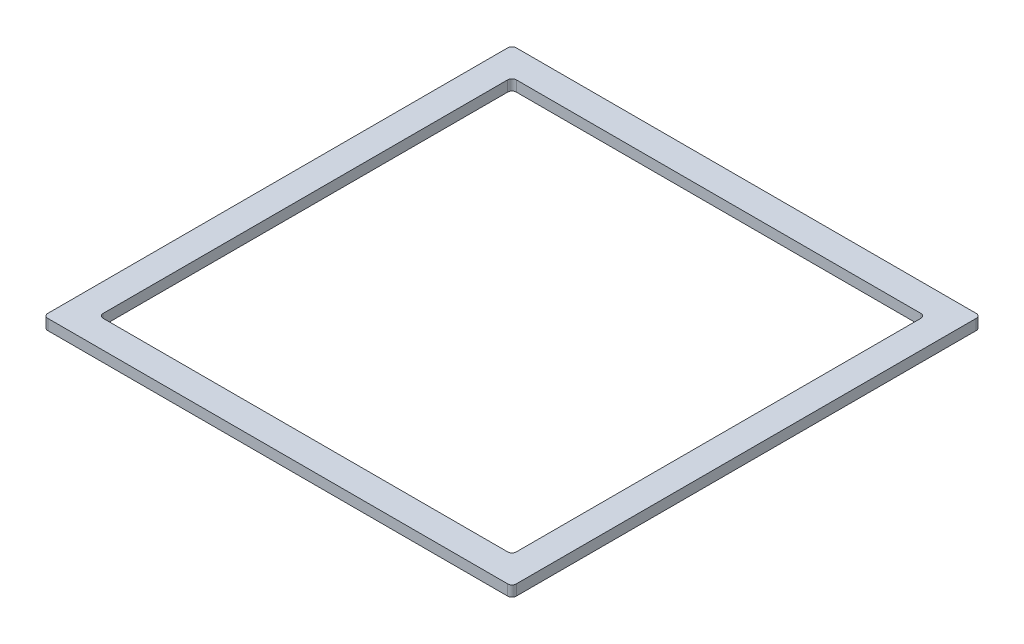
ISO-10303-21;
HEADER;
FILE_DESCRIPTION(('STEP AP214'),'2;1');
FILE_NAME('part.step','',(''),(''),'','','');
FILE_SCHEMA(('AUTOMOTIVE_DESIGN { 1 0 10303 214 1 1 1 1 }'));
ENDSEC;
DATA;
#1=APPLICATION_CONTEXT('core data for automotive mechanical design processes');
#2=APPLICATION_PROTOCOL_DEFINITION('international standard','automotive_design',2000,#1);
#3=PRODUCT_CONTEXT('',#1,'mechanical');
#4=PRODUCT('Part','Part','',(#3));
#5=PRODUCT_RELATED_PRODUCT_CATEGORY('part','',(#4));
#6=PRODUCT_DEFINITION_FORMATION('','',#4);
#7=PRODUCT_DEFINITION_CONTEXT('part definition',#1,'design');
#8=PRODUCT_DEFINITION('design','',#6,#7);
#9=PRODUCT_DEFINITION_SHAPE('','',#8);
#10=(LENGTH_UNIT() NAMED_UNIT(*) SI_UNIT(.MILLI.,.METRE.));
#11=(NAMED_UNIT(*) PLANE_ANGLE_UNIT() SI_UNIT($,.RADIAN.));
#12=(NAMED_UNIT(*) SI_UNIT($,.STERADIAN.) SOLID_ANGLE_UNIT());
#13=UNCERTAINTY_MEASURE_WITH_UNIT(LENGTH_MEASURE(1.E-05),#10,'distance_accuracy_value','');
#14=(GEOMETRIC_REPRESENTATION_CONTEXT(3) GLOBAL_UNCERTAINTY_ASSIGNED_CONTEXT((#13)) GLOBAL_UNIT_ASSIGNED_CONTEXT((#10,
#11,#12)) REPRESENTATION_CONTEXT('',''));
#15=CARTESIAN_POINT('',(0.,0.,0.));
#16=DIRECTION('',(0.,0.,1.));
#17=DIRECTION('',(1.,0.,0.));
#18=AXIS2_PLACEMENT_3D('',#15,#16,#17);
#19=CARTESIAN_POINT('',(0.,5.,0.));
#20=DIRECTION('',(0.,1.,0.));
#21=DIRECTION('',(0.,0.,1.));
#22=AXIS2_PLACEMENT_3D('',#19,#20,#21);
#23=PLANE('',#22);
#24=DIRECTION('',(0.,0.,1.));
#25=VECTOR('',#24,1.);
#26=CARTESIAN_POINT('',(-110.,5.,-110.));
#27=LINE('',#26,#25);
#28=CARTESIAN_POINT('',(-110.,5.,-108.));
#29=VERTEX_POINT('',#28);
#30=CARTESIAN_POINT('',(-110.,5.,108.));
#31=VERTEX_POINT('',#30);
#32=EDGE_CURVE('E178',#29,#31,#27,.T.);
#33=ORIENTED_EDGE('',*,*,#32,.T.);
#34=CARTESIAN_POINT('',(-108.,5.,108.));
#35=DIRECTION('',(0.,1.,0.));
#36=DIRECTION('',(0.,0.,1.));
#37=AXIS2_PLACEMENT_3D('',#34,#35,#36);
#38=CIRCLE('',#37,2.);
#39=CARTESIAN_POINT('',(-108.,5.,110.));
#40=VERTEX_POINT('',#39);
#41=EDGE_CURVE('E220',#31,#40,#38,.T.);
#42=ORIENTED_EDGE('',*,*,#41,.T.);
#43=DIRECTION('',(1.,0.,0.));
#44=VECTOR('',#43,1.);
#45=CARTESIAN_POINT('',(-110.,5.,110.));
#46=LINE('',#45,#44);
#47=CARTESIAN_POINT('',(108.,5.,110.));
#48=VERTEX_POINT('',#47);
#49=EDGE_CURVE('E173',#40,#48,#46,.T.);
#50=ORIENTED_EDGE('',*,*,#49,.T.);
#51=CARTESIAN_POINT('',(108.,5.,108.));
#52=DIRECTION('',(0.,1.,0.));
#53=DIRECTION('',(0.,0.,1.));
#54=AXIS2_PLACEMENT_3D('',#51,#52,#53);
#55=CIRCLE('',#54,2.);
#56=CARTESIAN_POINT('',(110.,5.,108.));
#57=VERTEX_POINT('',#56);
#58=EDGE_CURVE('E215',#48,#57,#55,.T.);
#59=ORIENTED_EDGE('',*,*,#58,.T.);
#60=DIRECTION('',(0.,0.,-1.));
#61=VECTOR('',#60,1.);
#62=CARTESIAN_POINT('',(110.,5.,-110.));
#63=LINE('',#62,#61);
#64=CARTESIAN_POINT('',(110.,5.,-108.));
#65=VERTEX_POINT('',#64);
#66=EDGE_CURVE('E270',#57,#65,#63,.T.);
#67=ORIENTED_EDGE('',*,*,#66,.T.);
#68=CARTESIAN_POINT('',(108.,5.,-108.));
#69=DIRECTION('',(0.,1.,0.));
#70=DIRECTION('',(0.,0.,1.));
#71=AXIS2_PLACEMENT_3D('',#68,#69,#70);
#72=CIRCLE('',#71,2.);
#73=CARTESIAN_POINT('',(108.,5.,-110.));
#74=VERTEX_POINT('',#73);
#75=EDGE_CURVE('E58',#65,#74,#72,.T.);
#76=ORIENTED_EDGE('',*,*,#75,.T.);
#77=DIRECTION('',(-1.,0.,0.));
#78=VECTOR('',#77,1.);
#79=CARTESIAN_POINT('',(-110.,5.,-110.));
#80=LINE('',#79,#78);
#81=CARTESIAN_POINT('',(-108.,5.,-110.));
#82=VERTEX_POINT('',#81);
#83=EDGE_CURVE('E272',#74,#82,#80,.T.);
#84=ORIENTED_EDGE('',*,*,#83,.T.);
#85=CARTESIAN_POINT('',(-108.,5.,-108.));
#86=DIRECTION('',(0.,1.,0.));
#87=DIRECTION('',(0.,0.,1.));
#88=AXIS2_PLACEMENT_3D('',#85,#86,#87);
#89=CIRCLE('',#88,2.);
#90=EDGE_CURVE('E218',#82,#29,#89,.T.);
#91=ORIENTED_EDGE('',*,*,#90,.T.);
#92=EDGE_LOOP('',(#33,#42,#50,#59,#67,#76,#84,#91));
#93=FACE_BOUND('',#92,.T.);
#94=DIRECTION('',(-1.,0.,0.));
#95=VECTOR('',#94,1.);
#96=CARTESIAN_POINT('',(-97.,5.,-97.));
#97=LINE('',#96,#95);
#98=CARTESIAN_POINT('',(94.9999999999999,5.,-97.));
#99=VERTEX_POINT('',#98);
#100=CARTESIAN_POINT('',(-95.,5.,-97.));
#101=VERTEX_POINT('',#100);
#102=EDGE_CURVE('E468',#99,#101,#97,.T.);
#103=ORIENTED_EDGE('',*,*,#102,.F.);
#104=CARTESIAN_POINT('',(95.,5.,-95.));
#105=DIRECTION('',(0.,1.,0.));
#106=DIRECTION('',(0.,0.,1.));
#107=AXIS2_PLACEMENT_3D('',#104,#105,#106);
#108=CIRCLE('',#107,2.);
#109=CARTESIAN_POINT('',(97.,5.,-95.));
#110=VERTEX_POINT('',#109);
#111=EDGE_CURVE('E11',#99,#110,#108,.F.);
#112=ORIENTED_EDGE('',*,*,#111,.T.);
#113=DIRECTION('',(0.,0.,-1.));
#114=VECTOR('',#113,1.);
#115=CARTESIAN_POINT('',(97.,5.,-97.));
#116=LINE('',#115,#114);
#117=CARTESIAN_POINT('',(97.,5.,95.));
#118=VERTEX_POINT('',#117);
#119=EDGE_CURVE('E249',#118,#110,#116,.T.);
#120=ORIENTED_EDGE('',*,*,#119,.F.);
#121=CARTESIAN_POINT('',(95.,5.,95.));
#122=DIRECTION('',(0.,1.,0.));
#123=DIRECTION('',(0.,0.,1.));
#124=AXIS2_PLACEMENT_3D('',#121,#122,#123);
#125=CIRCLE('',#124,2.);
#126=CARTESIAN_POINT('',(95.,5.,97.));
#127=VERTEX_POINT('',#126);
#128=EDGE_CURVE('E160',#118,#127,#125,.F.);
#129=ORIENTED_EDGE('',*,*,#128,.T.);
#130=DIRECTION('',(1.,0.,0.));
#131=VECTOR('',#130,1.);
#132=CARTESIAN_POINT('',(-97.,5.,97.));
#133=LINE('',#132,#131);
#134=CARTESIAN_POINT('',(-95.,5.,97.));
#135=VERTEX_POINT('',#134);
#136=EDGE_CURVE('E246',#135,#127,#133,.T.);
#137=ORIENTED_EDGE('',*,*,#136,.F.);
#138=CARTESIAN_POINT('',(-95.,5.,95.));
#139=DIRECTION('',(0.,1.,0.));
#140=DIRECTION('',(0.,0.,1.));
#141=AXIS2_PLACEMENT_3D('',#138,#139,#140);
#142=CIRCLE('',#141,2.);
#143=CARTESIAN_POINT('',(-97.,5.,95.));
#144=VERTEX_POINT('',#143);
#145=EDGE_CURVE('E237',#135,#144,#142,.F.);
#146=ORIENTED_EDGE('',*,*,#145,.T.);
#147=DIRECTION('',(0.,0.,1.));
#148=VECTOR('',#147,1.);
#149=CARTESIAN_POINT('',(-97.,5.,-97.));
#150=LINE('',#149,#148);
#151=CARTESIAN_POINT('',(-97.,5.,-95.));
#152=VERTEX_POINT('',#151);
#153=EDGE_CURVE('E258',#152,#144,#150,.T.);
#154=ORIENTED_EDGE('',*,*,#153,.F.);
#155=CARTESIAN_POINT('',(-95.,5.,-95.));
#156=DIRECTION('',(0.,1.,0.));
#157=DIRECTION('',(0.,0.,1.));
#158=AXIS2_PLACEMENT_3D('',#155,#156,#157);
#159=CIRCLE('',#158,2.);
#160=EDGE_CURVE('E233',#152,#101,#159,.F.);
#161=ORIENTED_EDGE('',*,*,#160,.T.);
#162=EDGE_LOOP('',(#103,#112,#120,#129,#137,#146,#154,#161));
#163=FACE_BOUND('',#162,.T.);
#164=ADVANCED_FACE('F36',(#93,#163),#23,.T.);
#165=CARTESIAN_POINT('',(0.,0.,0.));
#166=DIRECTION('',(0.,1.,0.));
#167=DIRECTION('',(0.,0.,1.));
#168=AXIS2_PLACEMENT_3D('',#165,#166,#167);
#169=PLANE('',#168);
#170=DIRECTION('',(1.,0.,0.));
#171=VECTOR('',#170,1.);
#172=CARTESIAN_POINT('',(-110.,0.,110.));
#173=LINE('',#172,#171);
#174=CARTESIAN_POINT('',(-108.,0.,110.));
#175=VERTEX_POINT('',#174);
#176=CARTESIAN_POINT('',(108.,0.,110.));
#177=VERTEX_POINT('',#176);
#178=EDGE_CURVE('E181',#175,#177,#173,.T.);
#179=ORIENTED_EDGE('',*,*,#178,.F.);
#180=CARTESIAN_POINT('',(-108.,0.,108.));
#181=DIRECTION('',(0.,1.,0.));
#182=DIRECTION('',(0.,0.,1.));
#183=AXIS2_PLACEMENT_3D('',#180,#181,#182);
#184=CIRCLE('',#183,2.);
#185=CARTESIAN_POINT('',(-110.,0.,108.));
#186=VERTEX_POINT('',#185);
#187=EDGE_CURVE('E208',#175,#186,#184,.F.);
#188=ORIENTED_EDGE('',*,*,#187,.T.);
#189=DIRECTION('',(0.,0.,1.));
#190=VECTOR('',#189,1.);
#191=CARTESIAN_POINT('',(-110.,0.,-110.));
#192=LINE('',#191,#190);
#193=CARTESIAN_POINT('',(-110.,0.,-108.));
#194=VERTEX_POINT('',#193);
#195=EDGE_CURVE('E279',#194,#186,#192,.T.);
#196=ORIENTED_EDGE('',*,*,#195,.F.);
#197=CARTESIAN_POINT('',(-108.,0.,-108.));
#198=DIRECTION('',(0.,1.,0.));
#199=DIRECTION('',(0.,0.,1.));
#200=AXIS2_PLACEMENT_3D('',#197,#198,#199);
#201=CIRCLE('',#200,2.);
#202=CARTESIAN_POINT('',(-108.,0.,-110.));
#203=VERTEX_POINT('',#202);
#204=EDGE_CURVE('E206',#194,#203,#201,.F.);
#205=ORIENTED_EDGE('',*,*,#204,.T.);
#206=DIRECTION('',(-1.,0.,0.));
#207=VECTOR('',#206,1.);
#208=CARTESIAN_POINT('',(-110.,0.,-110.));
#209=LINE('',#208,#207);
#210=CARTESIAN_POINT('',(108.,0.,-110.));
#211=VERTEX_POINT('',#210);
#212=EDGE_CURVE('E278',#211,#203,#209,.T.);
#213=ORIENTED_EDGE('',*,*,#212,.F.);
#214=CARTESIAN_POINT('',(108.,0.,-108.));
#215=DIRECTION('',(0.,1.,0.));
#216=DIRECTION('',(0.,0.,1.));
#217=AXIS2_PLACEMENT_3D('',#214,#215,#216);
#218=CIRCLE('',#217,2.);
#219=CARTESIAN_POINT('',(110.,0.,-108.));
#220=VERTEX_POINT('',#219);
#221=EDGE_CURVE('E204',#211,#220,#218,.F.);
#222=ORIENTED_EDGE('',*,*,#221,.T.);
#223=DIRECTION('',(0.,0.,-1.));
#224=VECTOR('',#223,1.);
#225=CARTESIAN_POINT('',(110.,0.,-110.));
#226=LINE('',#225,#224);
#227=CARTESIAN_POINT('',(110.,0.,108.));
#228=VERTEX_POINT('',#227);
#229=EDGE_CURVE('E257',#228,#220,#226,.T.);
#230=ORIENTED_EDGE('',*,*,#229,.F.);
#231=CARTESIAN_POINT('',(108.,0.,108.));
#232=DIRECTION('',(0.,1.,0.));
#233=DIRECTION('',(0.,0.,1.));
#234=AXIS2_PLACEMENT_3D('',#231,#232,#233);
#235=CIRCLE('',#234,2.);
#236=EDGE_CURVE('E202',#228,#177,#235,.F.);
#237=ORIENTED_EDGE('',*,*,#236,.T.);
#238=EDGE_LOOP('',(#179,#188,#196,#205,#213,#222,#230,#237));
#239=FACE_BOUND('',#238,.T.);
#240=DIRECTION('',(1.,0.,0.));
#241=VECTOR('',#240,1.);
#242=CARTESIAN_POINT('',(-97.,0.,97.));
#243=LINE('',#242,#241);
#244=CARTESIAN_POINT('',(-95.,0.,97.));
#245=VERTEX_POINT('',#244);
#246=CARTESIAN_POINT('',(95.,0.,97.));
#247=VERTEX_POINT('',#246);
#248=EDGE_CURVE('E261',#245,#247,#243,.T.);
#249=ORIENTED_EDGE('',*,*,#248,.T.);
#250=CARTESIAN_POINT('',(95.,0.,95.));
#251=DIRECTION('',(0.,1.,0.));
#252=DIRECTION('',(0.,0.,1.));
#253=AXIS2_PLACEMENT_3D('',#250,#251,#252);
#254=CIRCLE('',#253,2.);
#255=CARTESIAN_POINT('',(97.,0.,95.));
#256=VERTEX_POINT('',#255);
#257=EDGE_CURVE('E239',#247,#256,#254,.T.);
#258=ORIENTED_EDGE('',*,*,#257,.T.);
#259=DIRECTION('',(0.,0.,-1.));
#260=VECTOR('',#259,1.);
#261=CARTESIAN_POINT('',(97.,0.,-97.));
#262=LINE('',#261,#260);
#263=CARTESIAN_POINT('',(97.,0.,-95.));
#264=VERTEX_POINT('',#263);
#265=EDGE_CURVE('E155',#256,#264,#262,.T.);
#266=ORIENTED_EDGE('',*,*,#265,.T.);
#267=CARTESIAN_POINT('',(95.,0.,-95.));
#268=DIRECTION('',(0.,1.,0.));
#269=DIRECTION('',(0.,0.,1.));
#270=AXIS2_PLACEMENT_3D('',#267,#268,#269);
#271=CIRCLE('',#270,2.);
#272=CARTESIAN_POINT('',(94.9999999999999,0.,-97.));
#273=VERTEX_POINT('',#272);
#274=EDGE_CURVE('E44',#264,#273,#271,.T.);
#275=ORIENTED_EDGE('',*,*,#274,.T.);
#276=DIRECTION('',(-1.,0.,0.));
#277=VECTOR('',#276,1.);
#278=CARTESIAN_POINT('',(-97.,0.,-97.));
#279=LINE('',#278,#277);
#280=CARTESIAN_POINT('',(-95.,0.,-97.));
#281=VERTEX_POINT('',#280);
#282=EDGE_CURVE('E153',#273,#281,#279,.T.);
#283=ORIENTED_EDGE('',*,*,#282,.T.);
#284=CARTESIAN_POINT('',(-95.,0.,-95.));
#285=DIRECTION('',(0.,1.,0.));
#286=DIRECTION('',(0.,0.,1.));
#287=AXIS2_PLACEMENT_3D('',#284,#285,#286);
#288=CIRCLE('',#287,2.);
#289=CARTESIAN_POINT('',(-97.,0.,-95.));
#290=VERTEX_POINT('',#289);
#291=EDGE_CURVE('E231',#281,#290,#288,.T.);
#292=ORIENTED_EDGE('',*,*,#291,.T.);
#293=DIRECTION('',(0.,0.,1.));
#294=VECTOR('',#293,1.);
#295=CARTESIAN_POINT('',(-97.,0.,-97.));
#296=LINE('',#295,#294);
#297=CARTESIAN_POINT('',(-97.,0.,95.));
#298=VERTEX_POINT('',#297);
#299=EDGE_CURVE('E169',#290,#298,#296,.T.);
#300=ORIENTED_EDGE('',*,*,#299,.T.);
#301=CARTESIAN_POINT('',(-95.,0.,95.));
#302=DIRECTION('',(0.,1.,0.));
#303=DIRECTION('',(0.,0.,1.));
#304=AXIS2_PLACEMENT_3D('',#301,#302,#303);
#305=CIRCLE('',#304,2.);
#306=EDGE_CURVE('E235',#298,#245,#305,.T.);
#307=ORIENTED_EDGE('',*,*,#306,.T.);
#308=EDGE_LOOP('',(#249,#258,#266,#275,#283,#292,#300,#307));
#309=FACE_BOUND('',#308,.T.);
#310=ADVANCED_FACE('F152',(#239,#309),#169,.F.);
#311=CARTESIAN_POINT('',(110.,5.,-110.));
#312=DIRECTION('',(-1.,0.,0.));
#313=DIRECTION('',(0.,0.,1.));
#314=AXIS2_PLACEMENT_3D('',#311,#312,#313);
#315=PLANE('',#314);
#316=ORIENTED_EDGE('',*,*,#229,.T.);
#317=DIRECTION('',(0.,-1.,0.));
#318=VECTOR('',#317,1.);
#319=CARTESIAN_POINT('',(110.,5.,-108.));
#320=LINE('',#319,#318);
#321=EDGE_CURVE('E229',#220,#65,#320,.F.);
#322=ORIENTED_EDGE('',*,*,#321,.T.);
#323=ORIENTED_EDGE('',*,*,#66,.F.);
#324=DIRECTION('',(0.,-1.,0.));
#325=VECTOR('',#324,1.);
#326=CARTESIAN_POINT('',(110.,5.,108.));
#327=LINE('',#326,#325);
#328=EDGE_CURVE('E226',#57,#228,#327,.T.);
#329=ORIENTED_EDGE('',*,*,#328,.T.);
#330=EDGE_LOOP('',(#316,#322,#323,#329));
#331=FACE_BOUND('',#330,.T.);
#332=ADVANCED_FACE('F297',(#331),#315,.F.);
#333=CARTESIAN_POINT('',(-110.,5.,-110.));
#334=DIRECTION('',(0.,0.,1.));
#335=DIRECTION('',(1.,0.,0.));
#336=AXIS2_PLACEMENT_3D('',#333,#334,#335);
#337=PLANE('',#336);
#338=ORIENTED_EDGE('',*,*,#212,.T.);
#339=DIRECTION('',(0.,-1.,0.));
#340=VECTOR('',#339,1.);
#341=CARTESIAN_POINT('',(-108.,5.,-110.));
#342=LINE('',#341,#340);
#343=EDGE_CURVE('E51',#203,#82,#342,.F.);
#344=ORIENTED_EDGE('',*,*,#343,.T.);
#345=ORIENTED_EDGE('',*,*,#83,.F.);
#346=DIRECTION('',(0.,-1.,0.));
#347=VECTOR('',#346,1.);
#348=CARTESIAN_POINT('',(108.,5.,-110.));
#349=LINE('',#348,#347);
#350=EDGE_CURVE('E222',#74,#211,#349,.T.);
#351=ORIENTED_EDGE('',*,*,#350,.T.);
#352=EDGE_LOOP('',(#338,#344,#345,#351));
#353=FACE_BOUND('',#352,.T.);
#354=ADVANCED_FACE('F304',(#353),#337,.F.);
#355=CARTESIAN_POINT('',(-110.,5.,-110.));
#356=DIRECTION('',(1.,0.,0.));
#357=DIRECTION('',(0.,0.,-1.));
#358=AXIS2_PLACEMENT_3D('',#355,#356,#357);
#359=PLANE('',#358);
#360=ORIENTED_EDGE('',*,*,#195,.T.);
#361=DIRECTION('',(0.,-1.,0.));
#362=VECTOR('',#361,1.);
#363=CARTESIAN_POINT('',(-110.,5.,108.));
#364=LINE('',#363,#362);
#365=EDGE_CURVE('E213',#186,#31,#364,.F.);
#366=ORIENTED_EDGE('',*,*,#365,.T.);
#367=ORIENTED_EDGE('',*,*,#32,.F.);
#368=DIRECTION('',(0.,-1.,0.));
#369=VECTOR('',#368,1.);
#370=CARTESIAN_POINT('',(-110.,5.,-108.));
#371=LINE('',#370,#369);
#372=EDGE_CURVE('E210',#29,#194,#371,.T.);
#373=ORIENTED_EDGE('',*,*,#372,.T.);
#374=EDGE_LOOP('',(#360,#366,#367,#373));
#375=FACE_BOUND('',#374,.T.);
#376=ADVANCED_FACE('F310',(#375),#359,.F.);
#377=CARTESIAN_POINT('',(-110.,5.,110.));
#378=DIRECTION('',(0.,0.,-1.));
#379=DIRECTION('',(-1.,0.,0.));
#380=AXIS2_PLACEMENT_3D('',#377,#378,#379);
#381=PLANE('',#380);
#382=ORIENTED_EDGE('',*,*,#49,.F.);
#383=DIRECTION('',(0.,-1.,0.));
#384=VECTOR('',#383,1.);
#385=CARTESIAN_POINT('',(-108.,5.,110.));
#386=LINE('',#385,#384);
#387=EDGE_CURVE('E199',#40,#175,#386,.T.);
#388=ORIENTED_EDGE('',*,*,#387,.T.);
#389=ORIENTED_EDGE('',*,*,#178,.T.);
#390=DIRECTION('',(0.,-1.,0.));
#391=VECTOR('',#390,1.);
#392=CARTESIAN_POINT('',(108.,5.,110.));
#393=LINE('',#392,#391);
#394=EDGE_CURVE('E197',#177,#48,#393,.F.);
#395=ORIENTED_EDGE('',*,*,#394,.T.);
#396=EDGE_LOOP('',(#382,#388,#389,#395));
#397=FACE_BOUND('',#396,.T.);
#398=ADVANCED_FACE('F289',(#397),#381,.F.);
#399=CARTESIAN_POINT('',(97.,5.,-97.));
#400=DIRECTION('',(-1.,0.,0.));
#401=DIRECTION('',(0.,0.,1.));
#402=AXIS2_PLACEMENT_3D('',#399,#400,#401);
#403=PLANE('',#402);
#404=ORIENTED_EDGE('',*,*,#265,.F.);
#405=DIRECTION('',(0.,-1.,0.));
#406=VECTOR('',#405,1.);
#407=CARTESIAN_POINT('',(97.,5.,95.));
#408=LINE('',#407,#406);
#409=EDGE_CURVE('E195',#256,#118,#408,.F.);
#410=ORIENTED_EDGE('',*,*,#409,.T.);
#411=ORIENTED_EDGE('',*,*,#119,.T.);
#412=DIRECTION('',(0.,-1.,0.));
#413=VECTOR('',#412,1.);
#414=CARTESIAN_POINT('',(97.,0.,-95.));
#415=LINE('',#414,#413);
#416=EDGE_CURVE('E193',#110,#264,#415,.T.);
#417=ORIENTED_EDGE('',*,*,#416,.T.);
#418=EDGE_LOOP('',(#404,#410,#411,#417));
#419=FACE_BOUND('',#418,.T.);
#420=ADVANCED_FACE('F263',(#419),#403,.T.);
#421=CARTESIAN_POINT('',(-97.,5.,-97.));
#422=DIRECTION('',(0.,0.,1.));
#423=DIRECTION('',(1.,0.,0.));
#424=AXIS2_PLACEMENT_3D('',#421,#422,#423);
#425=PLANE('',#424);
#426=ORIENTED_EDGE('',*,*,#102,.T.);
#427=DIRECTION('',(0.,-1.,0.));
#428=VECTOR('',#427,1.);
#429=CARTESIAN_POINT('',(-95.,0.,-97.));
#430=LINE('',#429,#428);
#431=EDGE_CURVE('E168',#101,#281,#430,.T.);
#432=ORIENTED_EDGE('',*,*,#431,.T.);
#433=ORIENTED_EDGE('',*,*,#282,.F.);
#434=DIRECTION('',(0.,-1.,0.));
#435=VECTOR('',#434,1.);
#436=CARTESIAN_POINT('',(95.,5.,-97.));
#437=LINE('',#436,#435);
#438=EDGE_CURVE('E165',#273,#99,#437,.F.);
#439=ORIENTED_EDGE('',*,*,#438,.T.);
#440=EDGE_LOOP('',(#426,#432,#433,#439));
#441=FACE_BOUND('',#440,.T.);
#442=ADVANCED_FACE('F164',(#441),#425,.T.);
#443=CARTESIAN_POINT('',(-97.,5.,-97.));
#444=DIRECTION('',(1.,0.,0.));
#445=DIRECTION('',(0.,0.,-1.));
#446=AXIS2_PLACEMENT_3D('',#443,#444,#445);
#447=PLANE('',#446);
#448=ORIENTED_EDGE('',*,*,#299,.F.);
#449=DIRECTION('',(0.,-1.,0.));
#450=VECTOR('',#449,1.);
#451=CARTESIAN_POINT('',(-97.,5.,-95.));
#452=LINE('',#451,#450);
#453=EDGE_CURVE('E186',#290,#152,#452,.F.);
#454=ORIENTED_EDGE('',*,*,#453,.T.);
#455=ORIENTED_EDGE('',*,*,#153,.T.);
#456=DIRECTION('',(0.,-1.,0.));
#457=VECTOR('',#456,1.);
#458=CARTESIAN_POINT('',(-97.,0.,95.));
#459=LINE('',#458,#457);
#460=EDGE_CURVE('E175',#144,#298,#459,.T.);
#461=ORIENTED_EDGE('',*,*,#460,.T.);
#462=EDGE_LOOP('',(#448,#454,#455,#461));
#463=FACE_BOUND('',#462,.T.);
#464=ADVANCED_FACE('F401',(#463),#447,.T.);
#465=CARTESIAN_POINT('',(-97.,5.,97.));
#466=DIRECTION('',(0.,0.,-1.));
#467=DIRECTION('',(-1.,0.,0.));
#468=AXIS2_PLACEMENT_3D('',#465,#466,#467);
#469=PLANE('',#468);
#470=ORIENTED_EDGE('',*,*,#248,.F.);
#471=DIRECTION('',(0.,-1.,0.));
#472=VECTOR('',#471,1.);
#473=CARTESIAN_POINT('',(-95.,5.,97.));
#474=LINE('',#473,#472);
#475=EDGE_CURVE('E191',#245,#135,#474,.F.);
#476=ORIENTED_EDGE('',*,*,#475,.T.);
#477=ORIENTED_EDGE('',*,*,#136,.T.);
#478=DIRECTION('',(0.,-1.,0.));
#479=VECTOR('',#478,1.);
#480=CARTESIAN_POINT('',(95.,0.,97.));
#481=LINE('',#480,#479);
#482=EDGE_CURVE('E188',#127,#247,#481,.T.);
#483=ORIENTED_EDGE('',*,*,#482,.T.);
#484=EDGE_LOOP('',(#470,#476,#477,#483));
#485=FACE_BOUND('',#484,.T.);
#486=ADVANCED_FACE('F255',(#485),#469,.T.);
#487=CARTESIAN_POINT('',(-95.,5.,-95.));
#488=DIRECTION('',(0.,1.,0.));
#489=DIRECTION('',(0.,0.,1.));
#490=AXIS2_PLACEMENT_3D('',#487,#488,#489);
#491=CYLINDRICAL_SURFACE('',#490,2.);
#492=ORIENTED_EDGE('',*,*,#160,.F.);
#493=ORIENTED_EDGE('',*,*,#453,.F.);
#494=ORIENTED_EDGE('',*,*,#291,.F.);
#495=ORIENTED_EDGE('',*,*,#431,.F.);
#496=EDGE_LOOP('',(#492,#493,#494,#495));
#497=FACE_BOUND('',#496,.T.);
#498=ADVANCED_FACE('F339',(#497),#491,.F.);
#499=CARTESIAN_POINT('',(-95.,5.,95.));
#500=DIRECTION('',(0.,1.,0.));
#501=DIRECTION('',(0.,0.,1.));
#502=AXIS2_PLACEMENT_3D('',#499,#500,#501);
#503=CYLINDRICAL_SURFACE('',#502,2.);
#504=ORIENTED_EDGE('',*,*,#145,.F.);
#505=ORIENTED_EDGE('',*,*,#475,.F.);
#506=ORIENTED_EDGE('',*,*,#306,.F.);
#507=ORIENTED_EDGE('',*,*,#460,.F.);
#508=EDGE_LOOP('',(#504,#505,#506,#507));
#509=FACE_BOUND('',#508,.T.);
#510=ADVANCED_FACE('F342',(#509),#503,.F.);
#511=CARTESIAN_POINT('',(95.,5.,95.));
#512=DIRECTION('',(0.,1.,0.));
#513=DIRECTION('',(0.,0.,1.));
#514=AXIS2_PLACEMENT_3D('',#511,#512,#513);
#515=CYLINDRICAL_SURFACE('',#514,2.);
#516=ORIENTED_EDGE('',*,*,#128,.F.);
#517=ORIENTED_EDGE('',*,*,#409,.F.);
#518=ORIENTED_EDGE('',*,*,#257,.F.);
#519=ORIENTED_EDGE('',*,*,#482,.F.);
#520=EDGE_LOOP('',(#516,#517,#518,#519));
#521=FACE_BOUND('',#520,.T.);
#522=ADVANCED_FACE('F260',(#521),#515,.F.);
#523=CARTESIAN_POINT('',(95.,5.,-95.));
#524=DIRECTION('',(0.,1.,0.));
#525=DIRECTION('',(0.,0.,1.));
#526=AXIS2_PLACEMENT_3D('',#523,#524,#525);
#527=CYLINDRICAL_SURFACE('',#526,2.);
#528=ORIENTED_EDGE('',*,*,#111,.F.);
#529=ORIENTED_EDGE('',*,*,#438,.F.);
#530=ORIENTED_EDGE('',*,*,#274,.F.);
#531=ORIENTED_EDGE('',*,*,#416,.F.);
#532=EDGE_LOOP('',(#528,#529,#530,#531));
#533=FACE_BOUND('',#532,.T.);
#534=ADVANCED_FACE('F172',(#533),#527,.F.);
#535=CARTESIAN_POINT('',(-108.,5.,108.));
#536=DIRECTION('',(0.,-1.,0.));
#537=DIRECTION('',(0.,0.,-1.));
#538=AXIS2_PLACEMENT_3D('',#535,#536,#537);
#539=CYLINDRICAL_SURFACE('',#538,2.);
#540=ORIENTED_EDGE('',*,*,#41,.F.);
#541=ORIENTED_EDGE('',*,*,#365,.F.);
#542=ORIENTED_EDGE('',*,*,#187,.F.);
#543=ORIENTED_EDGE('',*,*,#387,.F.);
#544=EDGE_LOOP('',(#540,#541,#542,#543));
#545=FACE_BOUND('',#544,.T.);
#546=ADVANCED_FACE('F313',(#545),#539,.T.);
#547=CARTESIAN_POINT('',(-108.,5.,-108.));
#548=DIRECTION('',(0.,-1.,0.));
#549=DIRECTION('',(0.,0.,-1.));
#550=AXIS2_PLACEMENT_3D('',#547,#548,#549);
#551=CYLINDRICAL_SURFACE('',#550,2.);
#552=ORIENTED_EDGE('',*,*,#90,.F.);
#553=ORIENTED_EDGE('',*,*,#343,.F.);
#554=ORIENTED_EDGE('',*,*,#204,.F.);
#555=ORIENTED_EDGE('',*,*,#372,.F.);
#556=EDGE_LOOP('',(#552,#553,#554,#555));
#557=FACE_BOUND('',#556,.T.);
#558=ADVANCED_FACE('F308',(#557),#551,.T.);
#559=CARTESIAN_POINT('',(108.,5.,-108.));
#560=DIRECTION('',(0.,-1.,0.));
#561=DIRECTION('',(0.,0.,-1.));
#562=AXIS2_PLACEMENT_3D('',#559,#560,#561);
#563=CYLINDRICAL_SURFACE('',#562,2.);
#564=ORIENTED_EDGE('',*,*,#75,.F.);
#565=ORIENTED_EDGE('',*,*,#321,.F.);
#566=ORIENTED_EDGE('',*,*,#221,.F.);
#567=ORIENTED_EDGE('',*,*,#350,.F.);
#568=EDGE_LOOP('',(#564,#565,#566,#567));
#569=FACE_BOUND('',#568,.T.);
#570=ADVANCED_FACE('F301',(#569),#563,.T.);
#571=CARTESIAN_POINT('',(108.,5.,108.));
#572=DIRECTION('',(0.,-1.,0.));
#573=DIRECTION('',(0.,0.,-1.));
#574=AXIS2_PLACEMENT_3D('',#571,#572,#573);
#575=CYLINDRICAL_SURFACE('',#574,2.);
#576=ORIENTED_EDGE('',*,*,#58,.F.);
#577=ORIENTED_EDGE('',*,*,#394,.F.);
#578=ORIENTED_EDGE('',*,*,#236,.F.);
#579=ORIENTED_EDGE('',*,*,#328,.F.);
#580=EDGE_LOOP('',(#576,#577,#578,#579));
#581=FACE_BOUND('',#580,.T.);
#582=ADVANCED_FACE('F38',(#581),#575,.T.);
#583=CLOSED_SHELL('',(#164,#310,#332,#354,#376,#398,#420,#442,#464,#486,#498,#510,#522,#534,
#546,#558,#570,#582));
#584=MANIFOLD_SOLID_BREP('B2',#583);
#585=ADVANCED_BREP_SHAPE_REPRESENTATION('',(#18,#584),#14);
#586=SHAPE_DEFINITION_REPRESENTATION(#9,#585);
ENDSEC;
END-ISO-10303-21;
